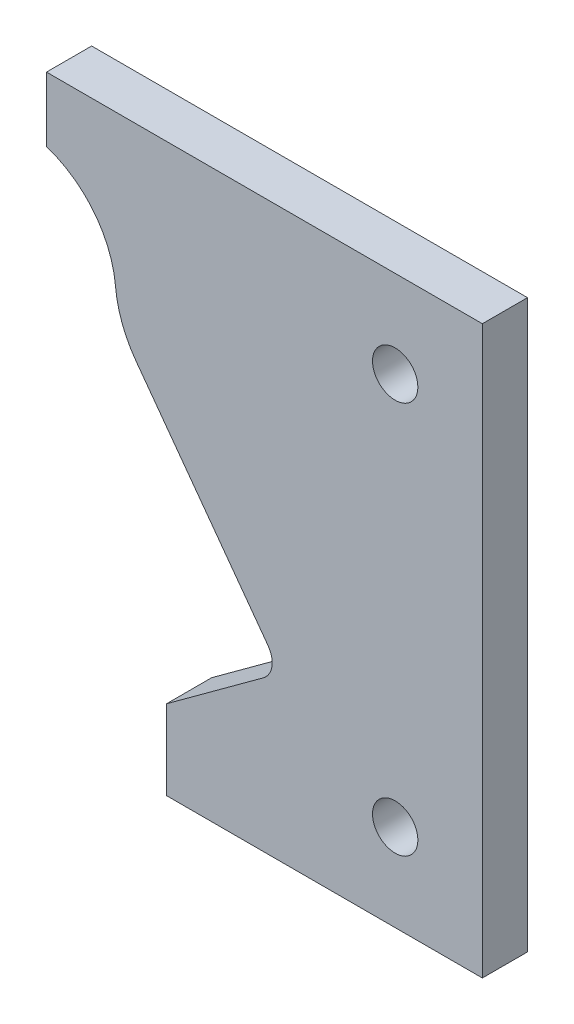
ISO-10303-21;
HEADER;
FILE_DESCRIPTION(('STEP AP214'),'2;1');
FILE_NAME('part.step','',(''),(''),'','','');
FILE_SCHEMA(('AUTOMOTIVE_DESIGN { 1 0 10303 214 1 1 1 1 }'));
ENDSEC;
DATA;
#1=APPLICATION_CONTEXT('core data for automotive mechanical design processes');
#2=APPLICATION_PROTOCOL_DEFINITION('international standard','automotive_design',2000,#1);
#3=PRODUCT_CONTEXT('',#1,'mechanical');
#4=PRODUCT('Part','Part','',(#3));
#5=PRODUCT_RELATED_PRODUCT_CATEGORY('part','',(#4));
#6=PRODUCT_DEFINITION_FORMATION('','',#4);
#7=PRODUCT_DEFINITION_CONTEXT('part definition',#1,'design');
#8=PRODUCT_DEFINITION('design','',#6,#7);
#9=PRODUCT_DEFINITION_SHAPE('','',#8);
#10=(LENGTH_UNIT() NAMED_UNIT(*) SI_UNIT(.MILLI.,.METRE.));
#11=(NAMED_UNIT(*) PLANE_ANGLE_UNIT() SI_UNIT($,.RADIAN.));
#12=(NAMED_UNIT(*) SI_UNIT($,.STERADIAN.) SOLID_ANGLE_UNIT());
#13=UNCERTAINTY_MEASURE_WITH_UNIT(LENGTH_MEASURE(1.E-05),#10,'distance_accuracy_value','');
#14=(GEOMETRIC_REPRESENTATION_CONTEXT(3) GLOBAL_UNCERTAINTY_ASSIGNED_CONTEXT((#13)) GLOBAL_UNIT_ASSIGNED_CONTEXT((#10,
#11,#12)) REPRESENTATION_CONTEXT('',''));
#15=CARTESIAN_POINT('',(0.,0.,0.));
#16=DIRECTION('',(0.,0.,1.));
#17=DIRECTION('',(1.,0.,0.));
#18=AXIS2_PLACEMENT_3D('',#15,#16,#17);
#19=CARTESIAN_POINT('',(17.8196036633842,19.5712704227745,3.2893));
#20=DIRECTION('',(0.,0.,-1.));
#21=DIRECTION('',(-1.,0.,0.));
#22=AXIS2_PLACEMENT_3D('',#19,#20,#21);
#23=CYLINDRICAL_SURFACE('',#22,15.8749999999984);
#24=CARTESIAN_POINT('',(17.8196036633842,19.5712704227745,-3.2893));
#25=DIRECTION('',(0.,0.,1.));
#26=DIRECTION('',(1.,0.,0.));
#27=AXIS2_PLACEMENT_3D('',#24,#25,#26);
#28=CIRCLE('',#27,15.8749999999984);
#29=CARTESIAN_POINT('',(5.00876855279595,10.1958702302884,-3.2893));
#30=VERTEX_POINT('',#29);
#31=CARTESIAN_POINT('',(2.01006723534087,18.1310680306367,-3.2893));
#32=VERTEX_POINT('',#31);
#33=EDGE_CURVE('E131',#30,#32,#28,.F.);
#34=ORIENTED_EDGE('',*,*,#33,.F.);
#35=DIRECTION('',(0.,0.,-1.));
#36=VECTOR('',#35,1.);
#37=CARTESIAN_POINT('',(5.00876855279595,10.1958702302884,3.2893));
#38=LINE('',#37,#36);
#39=CARTESIAN_POINT('',(5.00876855279595,10.1958702302884,3.2893));
#40=VERTEX_POINT('',#39);
#41=EDGE_CURVE('E119',#40,#30,#38,.T.);
#42=ORIENTED_EDGE('',*,*,#41,.F.);
#43=CARTESIAN_POINT('',(17.8196036633842,19.5712704227745,3.2893));
#44=DIRECTION('',(0.,0.,1.));
#45=DIRECTION('',(1.,0.,0.));
#46=AXIS2_PLACEMENT_3D('',#43,#44,#45);
#47=CIRCLE('',#46,15.8749999999984);
#48=CARTESIAN_POINT('',(2.01006723534087,18.1310680306367,3.2893));
#49=VERTEX_POINT('',#48);
#50=EDGE_CURVE('E125',#40,#49,#47,.F.);
#51=ORIENTED_EDGE('',*,*,#50,.T.);
#52=DIRECTION('',(0.,0.,-1.));
#53=VECTOR('',#52,1.);
#54=CARTESIAN_POINT('',(2.01006723534087,18.1310680306367,3.2893));
#55=LINE('',#54,#53);
#56=EDGE_CURVE('E168',#49,#32,#55,.T.);
#57=ORIENTED_EDGE('',*,*,#56,.T.);
#58=EDGE_LOOP('',(#34,#42,#51,#57));
#59=FACE_BOUND('',#58,.T.);
#60=ADVANCED_FACE('F43',(#59),#23,.T.);
#61=CARTESIAN_POINT('',(8.1210002032903,5.94322120391495,3.2893));
#62=DIRECTION('',(-0.80698173924974,-0.590576390077918,0.));
#63=DIRECTION('',(0.590576390077918,-0.80698173924974,0.));
#64=AXIS2_PLACEMENT_3D('',#61,#62,#63);
#65=PLANE('',#64);
#66=DIRECTION('',(-0.590576390077918,0.80698173924974,0.));
#67=VECTOR('',#66,1.);
#68=CARTESIAN_POINT('',(8.1210002032903,5.94322120391495,-3.2893));
#69=LINE('',#68,#67);
#70=CARTESIAN_POINT('',(24.2176673537273,-16.0517597526892,-3.2893));
#71=VERTEX_POINT('',#70);
#72=EDGE_CURVE('E256',#71,#30,#69,.T.);
#73=ORIENTED_EDGE('',*,*,#72,.F.);
#74=DIRECTION('',(0.,0.,-1.));
#75=VECTOR('',#74,1.);
#76=CARTESIAN_POINT('',(24.2176673537273,-16.0517597526892,3.2893));
#77=LINE('',#76,#75);
#78=CARTESIAN_POINT('',(24.2176673537273,-16.0517597526892,3.2893));
#79=VERTEX_POINT('',#78);
#80=EDGE_CURVE('E58',#71,#79,#77,.F.);
#81=ORIENTED_EDGE('',*,*,#80,.T.);
#82=DIRECTION('',(-0.590576390077918,0.80698173924974,0.));
#83=VECTOR('',#82,1.);
#84=CARTESIAN_POINT('',(8.1210002032903,5.94322120391495,3.2893));
#85=LINE('',#84,#83);
#86=EDGE_CURVE('E116',#79,#40,#85,.T.);
#87=ORIENTED_EDGE('',*,*,#86,.T.);
#88=ORIENTED_EDGE('',*,*,#41,.T.);
#89=EDGE_LOOP('',(#73,#81,#87,#88));
#90=FACE_BOUND('',#89,.T.);
#91=ADVANCED_FACE('F118',(#90),#65,.T.);
#92=CARTESIAN_POINT('',(17.9717471889344,-24.5571479787221,3.2893));
#93=DIRECTION('',(-0.590576390077917,0.80698173924974,0.));
#94=DIRECTION('',(-0.80698173924974,-0.590576390077917,0.));
#95=AXIS2_PLACEMENT_3D('',#92,#93,#94);
#96=PLANE('',#95);
#97=DIRECTION('',(0.80698173924974,0.590576390077918,0.));
#98=VECTOR('',#97,1.);
#99=CARTESIAN_POINT('',(17.9717471889344,-24.5571479787221,3.2893));
#100=LINE('',#99,#98);
#101=CARTESIAN_POINT('',(9.43866174846079,-30.8019470250383,3.2893));
#102=VERTEX_POINT('',#101);
#103=CARTESIAN_POINT('',(23.5305803701068,-20.4890068133045,3.2893));
#104=VERTEX_POINT('',#103);
#105=EDGE_CURVE('E124',#102,#104,#100,.T.);
#106=ORIENTED_EDGE('',*,*,#105,.T.);
#107=DIRECTION('',(0.,0.,-1.));
#108=VECTOR('',#107,1.);
#109=CARTESIAN_POINT('',(23.5305803701068,-20.4890068133045,-3.2893));
#110=LINE('',#109,#108);
#111=CARTESIAN_POINT('',(23.5305803701068,-20.4890068133045,-3.2893));
#112=VERTEX_POINT('',#111);
#113=EDGE_CURVE('E132',#104,#112,#110,.T.);
#114=ORIENTED_EDGE('',*,*,#113,.T.);
#115=DIRECTION('',(0.80698173924974,0.590576390077918,0.));
#116=VECTOR('',#115,1.);
#117=CARTESIAN_POINT('',(17.9717471889344,-24.5571479787221,-3.2893));
#118=LINE('',#117,#116);
#119=CARTESIAN_POINT('',(9.43866174846079,-30.8019470250383,-3.2893));
#120=VERTEX_POINT('',#119);
#121=EDGE_CURVE('E255',#120,#112,#118,.T.);
#122=ORIENTED_EDGE('',*,*,#121,.F.);
#123=DIRECTION('',(0.,0.,-1.));
#124=VECTOR('',#123,1.);
#125=CARTESIAN_POINT('',(9.43866174846079,-30.8019470250383,3.2893));
#126=LINE('',#125,#124);
#127=EDGE_CURVE('E133',#102,#120,#126,.T.);
#128=ORIENTED_EDGE('',*,*,#127,.F.);
#129=EDGE_LOOP('',(#106,#114,#122,#128));
#130=FACE_BOUND('',#129,.T.);
#131=ADVANCED_FACE('F272',(#130),#96,.T.);
#132=CARTESIAN_POINT('',(9.4386617484608,0.,3.2893));
#133=DIRECTION('',(-1.,0.,0.));
#134=DIRECTION('',(0.,-1.,0.));
#135=AXIS2_PLACEMENT_3D('',#132,#133,#134);
#136=PLANE('',#135);
#137=DIRECTION('',(0.,1.,0.));
#138=VECTOR('',#137,1.);
#139=CARTESIAN_POINT('',(9.4386617484608,0.,-3.2893));
#140=LINE('',#139,#138);
#141=CARTESIAN_POINT('',(9.43866174846079,-42.3980368445404,-3.2893));
#142=VERTEX_POINT('',#141);
#143=EDGE_CURVE('E226',#142,#120,#140,.T.);
#144=ORIENTED_EDGE('',*,*,#143,.F.);
#145=DIRECTION('',(0.,0.,-1.));
#146=VECTOR('',#145,1.);
#147=CARTESIAN_POINT('',(9.43866174846079,-42.3980368445404,3.2893));
#148=LINE('',#147,#146);
#149=CARTESIAN_POINT('',(9.43866174846079,-42.3980368445404,3.2893));
#150=VERTEX_POINT('',#149);
#151=EDGE_CURVE('E213',#150,#142,#148,.T.);
#152=ORIENTED_EDGE('',*,*,#151,.F.);
#153=DIRECTION('',(0.,1.,0.));
#154=VECTOR('',#153,1.);
#155=CARTESIAN_POINT('',(9.4386617484608,0.,3.2893));
#156=LINE('',#155,#154);
#157=EDGE_CURVE('E151',#150,#102,#156,.T.);
#158=ORIENTED_EDGE('',*,*,#157,.T.);
#159=ORIENTED_EDGE('',*,*,#127,.T.);
#160=EDGE_LOOP('',(#144,#152,#158,#159));
#161=FACE_BOUND('',#160,.T.);
#162=ADVANCED_FACE('F253',(#161),#136,.T.);
#163=CARTESIAN_POINT('',(0.,-42.3980368445404,3.2893));
#164=DIRECTION('',(0.,-1.,0.));
#165=DIRECTION('',(1.,0.,0.));
#166=AXIS2_PLACEMENT_3D('',#163,#164,#165);
#167=PLANE('',#166);
#168=DIRECTION('',(-1.,0.,0.));
#169=VECTOR('',#168,1.);
#170=CARTESIAN_POINT('',(0.,-42.3980368445404,-3.2893));
#171=LINE('',#170,#169);
#172=CARTESIAN_POINT('',(55.4502576006867,-42.3980368445404,-3.2893));
#173=VERTEX_POINT('',#172);
#174=EDGE_CURVE('E221',#173,#142,#171,.T.);
#175=ORIENTED_EDGE('',*,*,#174,.F.);
#176=DIRECTION('',(0.,0.,-1.));
#177=VECTOR('',#176,1.);
#178=CARTESIAN_POINT('',(55.4502576006867,-42.3980368445404,3.2893));
#179=LINE('',#178,#177);
#180=CARTESIAN_POINT('',(55.4502576006867,-42.3980368445404,3.2893));
#181=VERTEX_POINT('',#180);
#182=EDGE_CURVE('E211',#181,#173,#179,.T.);
#183=ORIENTED_EDGE('',*,*,#182,.F.);
#184=DIRECTION('',(-1.,0.,0.));
#185=VECTOR('',#184,1.);
#186=CARTESIAN_POINT('',(0.,-42.3980368445404,3.2893));
#187=LINE('',#186,#185);
#188=EDGE_CURVE('E154',#181,#150,#187,.T.);
#189=ORIENTED_EDGE('',*,*,#188,.T.);
#190=ORIENTED_EDGE('',*,*,#151,.T.);
#191=EDGE_LOOP('',(#175,#183,#189,#190));
#192=FACE_BOUND('',#191,.T.);
#193=ADVANCED_FACE('F249',(#192),#167,.T.);
#194=CARTESIAN_POINT('',(55.4502576006867,0.,3.2893));
#195=DIRECTION('',(1.,0.,0.));
#196=DIRECTION('',(0.,1.,0.));
#197=AXIS2_PLACEMENT_3D('',#194,#195,#196);
#198=PLANE('',#197);
#199=DIRECTION('',(0.,-1.,0.));
#200=VECTOR('',#199,1.);
#201=CARTESIAN_POINT('',(55.4502576006867,0.,-3.2893));
#202=LINE('',#201,#200);
#203=CARTESIAN_POINT('',(55.4502576006867,40.1519631554596,-3.2893));
#204=VERTEX_POINT('',#203);
#205=EDGE_CURVE('E225',#204,#173,#202,.T.);
#206=ORIENTED_EDGE('',*,*,#205,.F.);
#207=DIRECTION('',(0.,0.,-1.));
#208=VECTOR('',#207,1.);
#209=CARTESIAN_POINT('',(55.4502576006867,40.1519631554596,3.2893));
#210=LINE('',#209,#208);
#211=CARTESIAN_POINT('',(55.4502576006867,40.1519631554596,3.2893));
#212=VERTEX_POINT('',#211);
#213=EDGE_CURVE('E209',#212,#204,#210,.T.);
#214=ORIENTED_EDGE('',*,*,#213,.F.);
#215=DIRECTION('',(0.,-1.,0.));
#216=VECTOR('',#215,1.);
#217=CARTESIAN_POINT('',(55.4502576006867,0.,3.2893));
#218=LINE('',#217,#216);
#219=EDGE_CURVE('E157',#212,#181,#218,.T.);
#220=ORIENTED_EDGE('',*,*,#219,.T.);
#221=ORIENTED_EDGE('',*,*,#182,.T.);
#222=EDGE_LOOP('',(#206,#214,#220,#221));
#223=FACE_BOUND('',#222,.T.);
#224=ADVANCED_FACE('F244',(#223),#198,.T.);
#225=CARTESIAN_POINT('',(0.,40.1519631554596,3.2893));
#226=DIRECTION('',(0.,1.,0.));
#227=DIRECTION('',(0.,0.,1.));
#228=AXIS2_PLACEMENT_3D('',#225,#226,#227);
#229=PLANE('',#228);
#230=DIRECTION('',(1.,0.,0.));
#231=VECTOR('',#230,1.);
#232=CARTESIAN_POINT('',(0.,40.1519631554596,-3.2893));
#233=LINE('',#232,#231);
#234=CARTESIAN_POINT('',(-8.04974239931328,40.1519631554596,-3.2893));
#235=VERTEX_POINT('',#234);
#236=EDGE_CURVE('E229',#235,#204,#233,.T.);
#237=ORIENTED_EDGE('',*,*,#236,.F.);
#238=DIRECTION('',(0.,0.,-1.));
#239=VECTOR('',#238,1.);
#240=CARTESIAN_POINT('',(-8.04974239931328,40.1519631554596,3.2893));
#241=LINE('',#240,#239);
#242=CARTESIAN_POINT('',(-8.04974239931328,40.1519631554596,3.2893));
#243=VERTEX_POINT('',#242);
#244=EDGE_CURVE('E207',#243,#235,#241,.T.);
#245=ORIENTED_EDGE('',*,*,#244,.F.);
#246=DIRECTION('',(1.,0.,0.));
#247=VECTOR('',#246,1.);
#248=CARTESIAN_POINT('',(0.,40.1519631554596,3.2893));
#249=LINE('',#248,#247);
#250=EDGE_CURVE('E160',#243,#212,#249,.T.);
#251=ORIENTED_EDGE('',*,*,#250,.T.);
#252=ORIENTED_EDGE('',*,*,#213,.T.);
#253=EDGE_LOOP('',(#237,#245,#251,#252));
#254=FACE_BOUND('',#253,.T.);
#255=ADVANCED_FACE('F240',(#254),#229,.T.);
#256=CARTESIAN_POINT('',(-8.04974239931328,0.,3.2893));
#257=DIRECTION('',(-1.,0.,0.));
#258=DIRECTION('',(0.,0.,1.));
#259=AXIS2_PLACEMENT_3D('',#256,#257,#258);
#260=PLANE('',#259);
#261=DIRECTION('',(0.,1.,0.));
#262=VECTOR('',#261,1.);
#263=CARTESIAN_POINT('',(-8.04974239931328,0.,-3.2893));
#264=LINE('',#263,#262);
#265=CARTESIAN_POINT('',(-8.04974239931328,30.7539631554596,-3.2893));
#266=VERTEX_POINT('',#265);
#267=EDGE_CURVE('E142',#266,#235,#264,.T.);
#268=ORIENTED_EDGE('',*,*,#267,.F.);
#269=DIRECTION('',(0.,0.,-1.));
#270=VECTOR('',#269,1.);
#271=CARTESIAN_POINT('',(-8.04974239931328,30.7539631554596,3.2893));
#272=LINE('',#271,#270);
#273=CARTESIAN_POINT('',(-8.04974239931328,30.7539631554596,3.2893));
#274=VERTEX_POINT('',#273);
#275=EDGE_CURVE('E204',#274,#266,#272,.T.);
#276=ORIENTED_EDGE('',*,*,#275,.F.);
#277=DIRECTION('',(0.,1.,0.));
#278=VECTOR('',#277,1.);
#279=CARTESIAN_POINT('',(-8.04974239931328,0.,3.2893));
#280=LINE('',#279,#278);
#281=EDGE_CURVE('E163',#274,#243,#280,.T.);
#282=ORIENTED_EDGE('',*,*,#281,.T.);
#283=ORIENTED_EDGE('',*,*,#244,.T.);
#284=EDGE_LOOP('',(#268,#276,#282,#283));
#285=FACE_BOUND('',#284,.T.);
#286=ADVANCED_FACE('F237',(#285),#260,.T.);
#287=CARTESIAN_POINT('',(-12.6105920533151,16.7991688583876,3.2893));
#288=DIRECTION('',(0.,0.,-1.));
#289=DIRECTION('',(-1.,0.,0.));
#290=AXIS2_PLACEMENT_3D('',#287,#288,#289);
#291=CYLINDRICAL_SURFACE('',#290,14.6812);
#292=CARTESIAN_POINT('',(-12.6105920533151,16.7991688583876,-3.2893));
#293=DIRECTION('',(0.,0.,1.));
#294=DIRECTION('',(1.,0.,0.));
#295=AXIS2_PLACEMENT_3D('',#292,#293,#294);
#296=CIRCLE('',#295,14.6812);
#297=EDGE_CURVE('E139',#32,#266,#296,.T.);
#298=ORIENTED_EDGE('',*,*,#297,.F.);
#299=ORIENTED_EDGE('',*,*,#56,.F.);
#300=CARTESIAN_POINT('',(-12.6105920533151,16.7991688583876,3.2893));
#301=DIRECTION('',(0.,0.,1.));
#302=DIRECTION('',(1.,0.,0.));
#303=AXIS2_PLACEMENT_3D('',#300,#301,#302);
#304=CIRCLE('',#303,14.6812);
#305=EDGE_CURVE('E138',#49,#274,#304,.T.);
#306=ORIENTED_EDGE('',*,*,#305,.T.);
#307=ORIENTED_EDGE('',*,*,#275,.T.);
#308=EDGE_LOOP('',(#298,#299,#306,#307));
#309=FACE_BOUND('',#308,.T.);
#310=ADVANCED_FACE('F276',(#309),#291,.F.);
#311=CARTESIAN_POINT('',(0.,0.,3.2893));
#312=DIRECTION('',(0.,0.,1.));
#313=DIRECTION('',(1.,0.,0.));
#314=AXIS2_PLACEMENT_3D('',#311,#312,#313);
#315=PLANE('',#314);
#316=CARTESIAN_POINT('',(42.7502576006867,27.4519631554596,3.2893));
#317=DIRECTION('',(0.,0.,1.));
#318=DIRECTION('',(1.,0.,0.));
#319=AXIS2_PLACEMENT_3D('',#316,#317,#318);
#320=CIRCLE('',#319,3.302);
#321=CARTESIAN_POINT('',(46.0522576006867,27.4519631554596,3.2893));
#322=VERTEX_POINT('',#321);
#323=EDGE_CURVE('E186',#322,#322,#320,.T.);
#324=ORIENTED_EDGE('',*,*,#323,.F.);
#325=EDGE_LOOP('',(#324));
#326=FACE_BOUND('',#325,.T.);
#327=CARTESIAN_POINT('',(42.7502576006867,-29.6980368445404,3.2893));
#328=DIRECTION('',(0.,0.,1.));
#329=DIRECTION('',(1.,0.,0.));
#330=AXIS2_PLACEMENT_3D('',#327,#328,#329);
#331=CIRCLE('',#330,3.302);
#332=CARTESIAN_POINT('',(46.0522576006867,-29.6980368445404,3.2893));
#333=VERTEX_POINT('',#332);
#334=EDGE_CURVE('E179',#333,#333,#331,.T.);
#335=ORIENTED_EDGE('',*,*,#334,.F.);
#336=EDGE_LOOP('',(#335));
#337=FACE_BOUND('',#336,.T.);
#338=ORIENTED_EDGE('',*,*,#50,.F.);
#339=ORIENTED_EDGE('',*,*,#86,.F.);
#340=CARTESIAN_POINT('',(21.6555003316094,-17.9268397911866,3.2893));
#341=DIRECTION('',(0.,0.,1.));
#342=DIRECTION('',(1.,0.,0.));
#343=AXIS2_PLACEMENT_3D('',#340,#341,#342);
#344=CIRCLE('',#343,3.175);
#345=EDGE_CURVE('E12',#79,#104,#344,.F.);
#346=ORIENTED_EDGE('',*,*,#345,.T.);
#347=ORIENTED_EDGE('',*,*,#105,.F.);
#348=ORIENTED_EDGE('',*,*,#157,.F.);
#349=ORIENTED_EDGE('',*,*,#188,.F.);
#350=ORIENTED_EDGE('',*,*,#219,.F.);
#351=ORIENTED_EDGE('',*,*,#250,.F.);
#352=ORIENTED_EDGE('',*,*,#281,.F.);
#353=ORIENTED_EDGE('',*,*,#305,.F.);
#354=EDGE_LOOP('',(#338,#339,#346,#347,#348,#349,#350,#351,#352,#353));
#355=FACE_BOUND('',#354,.T.);
#356=ADVANCED_FACE('F135',(#326,#337,#355),#315,.T.);
#357=CARTESIAN_POINT('',(0.,0.,-3.2893));
#358=DIRECTION('',(0.,0.,1.));
#359=DIRECTION('',(1.,0.,0.));
#360=AXIS2_PLACEMENT_3D('',#357,#358,#359);
#361=PLANE('',#360);
#362=CARTESIAN_POINT('',(42.7502576006867,27.4519631554596,-3.2893));
#363=DIRECTION('',(0.,0.,1.));
#364=DIRECTION('',(1.,0.,0.));
#365=AXIS2_PLACEMENT_3D('',#362,#363,#364);
#366=CIRCLE('',#365,3.302);
#367=CARTESIAN_POINT('',(46.0522576006867,27.4519631554596,-3.2893));
#368=VERTEX_POINT('',#367);
#369=EDGE_CURVE('E182',#368,#368,#366,.T.);
#370=ORIENTED_EDGE('',*,*,#369,.T.);
#371=EDGE_LOOP('',(#370));
#372=FACE_BOUND('',#371,.T.);
#373=CARTESIAN_POINT('',(42.7502576006867,-29.6980368445404,-3.2893));
#374=DIRECTION('',(0.,0.,1.));
#375=DIRECTION('',(1.,0.,0.));
#376=AXIS2_PLACEMENT_3D('',#373,#374,#375);
#377=CIRCLE('',#376,3.302);
#378=CARTESIAN_POINT('',(46.0522576006867,-29.6980368445404,-3.2893));
#379=VERTEX_POINT('',#378);
#380=EDGE_CURVE('E145',#379,#379,#377,.T.);
#381=ORIENTED_EDGE('',*,*,#380,.T.);
#382=EDGE_LOOP('',(#381));
#383=FACE_BOUND('',#382,.T.);
#384=ORIENTED_EDGE('',*,*,#33,.T.);
#385=ORIENTED_EDGE('',*,*,#297,.T.);
#386=ORIENTED_EDGE('',*,*,#267,.T.);
#387=ORIENTED_EDGE('',*,*,#236,.T.);
#388=ORIENTED_EDGE('',*,*,#205,.T.);
#389=ORIENTED_EDGE('',*,*,#174,.T.);
#390=ORIENTED_EDGE('',*,*,#143,.T.);
#391=ORIENTED_EDGE('',*,*,#121,.T.);
#392=CARTESIAN_POINT('',(21.6555003316094,-17.9268397911866,-3.2893));
#393=DIRECTION('',(0.,0.,1.));
#394=DIRECTION('',(1.,0.,0.));
#395=AXIS2_PLACEMENT_3D('',#392,#393,#394);
#396=CIRCLE('',#395,3.175);
#397=EDGE_CURVE('E51',#112,#71,#396,.T.);
#398=ORIENTED_EDGE('',*,*,#397,.T.);
#399=ORIENTED_EDGE('',*,*,#72,.T.);
#400=EDGE_LOOP('',(#384,#385,#386,#387,#388,#389,#390,#391,#398,#399));
#401=FACE_BOUND('',#400,.T.);
#402=ADVANCED_FACE('F234',(#372,#383,#401),#361,.F.);
#403=CARTESIAN_POINT('',(21.6555003316094,-17.9268397911866,3.2893));
#404=DIRECTION('',(0.,0.,1.));
#405=DIRECTION('',(1.,0.,0.));
#406=AXIS2_PLACEMENT_3D('',#403,#404,#405);
#407=CYLINDRICAL_SURFACE('',#406,3.175);
#408=ORIENTED_EDGE('',*,*,#345,.F.);
#409=ORIENTED_EDGE('',*,*,#80,.F.);
#410=ORIENTED_EDGE('',*,*,#397,.F.);
#411=ORIENTED_EDGE('',*,*,#113,.F.);
#412=EDGE_LOOP('',(#408,#409,#410,#411));
#413=FACE_BOUND('',#412,.T.);
#414=ADVANCED_FACE('F45',(#413),#407,.F.);
#415=CARTESIAN_POINT('',(42.7502576006867,-29.6980368445404,3.2893));
#416=DIRECTION('',(0.,0.,1.));
#417=DIRECTION('',(1.,0.,0.));
#418=AXIS2_PLACEMENT_3D('',#415,#416,#417);
#419=CYLINDRICAL_SURFACE('',#418,3.302);
#420=ORIENTED_EDGE('',*,*,#380,.F.);
#421=EDGE_LOOP('',(#420));
#422=FACE_BOUND('',#421,.T.);
#423=ORIENTED_EDGE('',*,*,#334,.T.);
#424=EDGE_LOOP('',(#423));
#425=FACE_BOUND('',#424,.T.);
#426=ADVANCED_FACE('F281',(#422,#425),#419,.F.);
#427=CARTESIAN_POINT('',(42.7502576006867,27.4519631554596,3.2893));
#428=DIRECTION('',(0.,0.,1.));
#429=DIRECTION('',(1.,0.,0.));
#430=AXIS2_PLACEMENT_3D('',#427,#428,#429);
#431=CYLINDRICAL_SURFACE('',#430,3.302);
#432=ORIENTED_EDGE('',*,*,#369,.F.);
#433=EDGE_LOOP('',(#432));
#434=FACE_BOUND('',#433,.T.);
#435=ORIENTED_EDGE('',*,*,#323,.T.);
#436=EDGE_LOOP('',(#435));
#437=FACE_BOUND('',#436,.T.);
#438=ADVANCED_FACE('F284',(#434,#437),#431,.F.);
#439=CLOSED_SHELL('',(#60,#91,#131,#162,#193,#224,#255,#286,#310,#356,#402,#414,#426,#438));
#440=MANIFOLD_SOLID_BREP('B2',#439);
#441=ADVANCED_BREP_SHAPE_REPRESENTATION('',(#18,#440),#14);
#442=SHAPE_DEFINITION_REPRESENTATION(#9,#441);
ENDSEC;
END-ISO-10303-21;
